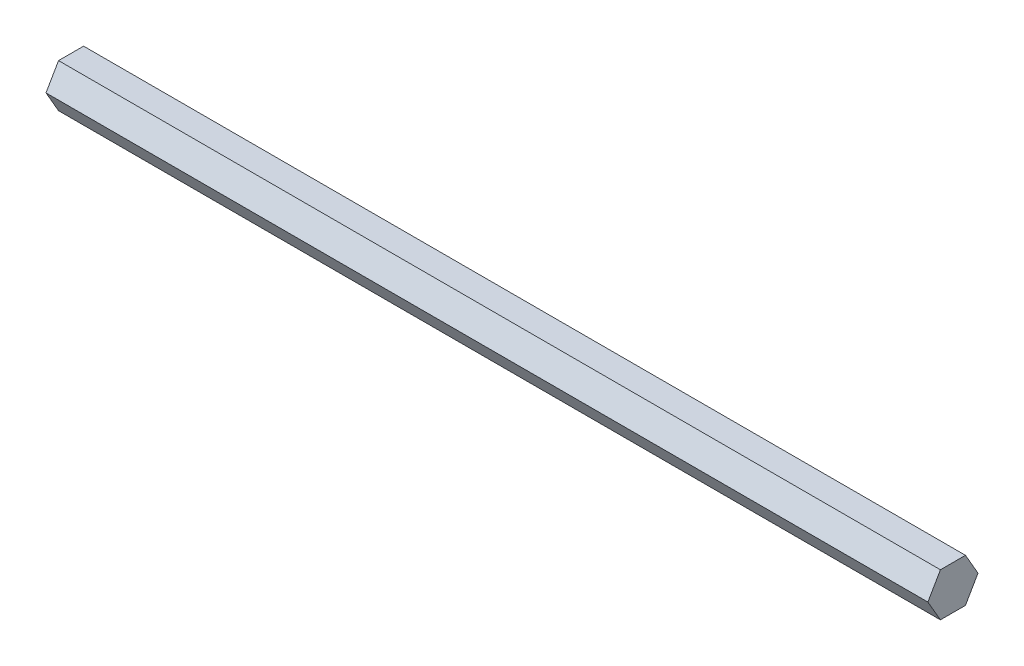
ISO-10303-21;
HEADER;
FILE_DESCRIPTION(('STEP AP214'),'2;1');
FILE_NAME('part.step','',(''),(''),'','','');
FILE_SCHEMA(('AUTOMOTIVE_DESIGN { 1 0 10303 214 1 1 1 1 }'));
ENDSEC;
DATA;
#1=APPLICATION_CONTEXT('core data for automotive mechanical design processes');
#2=APPLICATION_PROTOCOL_DEFINITION('international standard','automotive_design',2000,#1);
#3=PRODUCT_CONTEXT('',#1,'mechanical');
#4=PRODUCT('Part','Part','',(#3));
#5=PRODUCT_RELATED_PRODUCT_CATEGORY('part','',(#4));
#6=PRODUCT_DEFINITION_FORMATION('','',#4);
#7=PRODUCT_DEFINITION_CONTEXT('part definition',#1,'design');
#8=PRODUCT_DEFINITION('design','',#6,#7);
#9=PRODUCT_DEFINITION_SHAPE('','',#8);
#10=(LENGTH_UNIT() NAMED_UNIT(*) SI_UNIT(.MILLI.,.METRE.));
#11=(NAMED_UNIT(*) PLANE_ANGLE_UNIT() SI_UNIT($,.RADIAN.));
#12=(NAMED_UNIT(*) SI_UNIT($,.STERADIAN.) SOLID_ANGLE_UNIT());
#13=UNCERTAINTY_MEASURE_WITH_UNIT(LENGTH_MEASURE(1.E-05),#10,'distance_accuracy_value','');
#14=(GEOMETRIC_REPRESENTATION_CONTEXT(3) GLOBAL_UNCERTAINTY_ASSIGNED_CONTEXT((#13)) GLOBAL_UNIT_ASSIGNED_CONTEXT((#10,
#11,#12)) REPRESENTATION_CONTEXT('',''));
#15=CARTESIAN_POINT('',(0.,0.,0.));
#16=DIRECTION('',(0.,0.,1.));
#17=DIRECTION('',(1.,0.,0.));
#18=AXIS2_PLACEMENT_3D('',#15,#16,#17);
#19=CARTESIAN_POINT('',(101.6,0.,-2.88675134594813));
#20=DIRECTION('',(0.,-0.5,0.866025403784439));
#21=DIRECTION('',(0.,-0.866025403784439,-0.5));
#22=AXIS2_PLACEMENT_3D('',#19,#20,#21);
#23=PLANE('',#22);
#24=DIRECTION('',(0.,0.866025403784439,0.5));
#25=VECTOR('',#24,1.);
#26=CARTESIAN_POINT('',(0.,0.,-2.88675134594813));
#27=LINE('',#26,#25);
#28=CARTESIAN_POINT('',(0.,0.,-2.88675134594813));
#29=VERTEX_POINT('',#28);
#30=CARTESIAN_POINT('',(0.,2.5,-1.44337567297406));
#31=VERTEX_POINT('',#30);
#32=EDGE_CURVE('E125',#29,#31,#27,.T.);
#33=ORIENTED_EDGE('',*,*,#32,.T.);
#34=DIRECTION('',(-1.,0.,0.));
#35=VECTOR('',#34,1.);
#36=CARTESIAN_POINT('',(101.6,2.5,-1.44337567297406));
#37=LINE('',#36,#35);
#38=CARTESIAN_POINT('',(101.6,2.5,-1.44337567297406));
#39=VERTEX_POINT('',#38);
#40=EDGE_CURVE('E11',#39,#31,#37,.T.);
#41=ORIENTED_EDGE('',*,*,#40,.F.);
#42=DIRECTION('',(0.,0.866025403784439,0.5));
#43=VECTOR('',#42,1.);
#44=CARTESIAN_POINT('',(101.6,0.,-2.88675134594813));
#45=LINE('',#44,#43);
#46=CARTESIAN_POINT('',(101.6,0.,-2.88675134594813));
#47=VERTEX_POINT('',#46);
#48=EDGE_CURVE('E135',#47,#39,#45,.T.);
#49=ORIENTED_EDGE('',*,*,#48,.F.);
#50=DIRECTION('',(-1.,0.,0.));
#51=VECTOR('',#50,1.);
#52=CARTESIAN_POINT('',(101.6,0.,-2.88675134594813));
#53=LINE('',#52,#51);
#54=EDGE_CURVE('E121',#47,#29,#53,.T.);
#55=ORIENTED_EDGE('',*,*,#54,.T.);
#56=EDGE_LOOP('',(#33,#41,#49,#55));
#57=FACE_BOUND('',#56,.T.);
#58=ADVANCED_FACE('F41',(#57),#23,.F.);
#59=CARTESIAN_POINT('',(101.6,2.5,-1.44337567297406));
#60=DIRECTION('',(0.,-1.,0.));
#61=DIRECTION('',(0.,0.,-1.));
#62=AXIS2_PLACEMENT_3D('',#59,#60,#61);
#63=PLANE('',#62);
#64=DIRECTION('',(0.,0.,1.));
#65=VECTOR('',#64,1.);
#66=CARTESIAN_POINT('',(0.,2.5,-1.44337567297406));
#67=LINE('',#66,#65);
#68=CARTESIAN_POINT('',(0.,2.5,1.44337567297406));
#69=VERTEX_POINT('',#68);
#70=EDGE_CURVE('E128',#31,#69,#67,.T.);
#71=ORIENTED_EDGE('',*,*,#70,.T.);
#72=DIRECTION('',(-1.,0.,0.));
#73=VECTOR('',#72,1.);
#74=CARTESIAN_POINT('',(101.6,2.5,1.44337567297406));
#75=LINE('',#74,#73);
#76=CARTESIAN_POINT('',(101.6,2.5,1.44337567297406));
#77=VERTEX_POINT('',#76);
#78=EDGE_CURVE('E49',#77,#69,#75,.T.);
#79=ORIENTED_EDGE('',*,*,#78,.F.);
#80=DIRECTION('',(0.,0.,1.));
#81=VECTOR('',#80,1.);
#82=CARTESIAN_POINT('',(101.6,2.5,-1.44337567297406));
#83=LINE('',#82,#81);
#84=EDGE_CURVE('E94',#39,#77,#83,.T.);
#85=ORIENTED_EDGE('',*,*,#84,.F.);
#86=ORIENTED_EDGE('',*,*,#40,.T.);
#87=EDGE_LOOP('',(#71,#79,#85,#86));
#88=FACE_BOUND('',#87,.T.);
#89=ADVANCED_FACE('F159',(#88),#63,.F.);
#90=CARTESIAN_POINT('',(101.6,2.5,1.44337567297406));
#91=DIRECTION('',(0.,-0.5,-0.866025403784439));
#92=DIRECTION('',(0.,0.866025403784439,-0.5));
#93=AXIS2_PLACEMENT_3D('',#90,#91,#92);
#94=PLANE('',#93);
#95=DIRECTION('',(0.,-0.866025403784439,0.5));
#96=VECTOR('',#95,1.);
#97=CARTESIAN_POINT('',(0.,2.5,1.44337567297406));
#98=LINE('',#97,#96);
#99=CARTESIAN_POINT('',(0.,0.,2.88675134594813));
#100=VERTEX_POINT('',#99);
#101=EDGE_CURVE('E130',#69,#100,#98,.T.);
#102=ORIENTED_EDGE('',*,*,#101,.T.);
#103=DIRECTION('',(-1.,0.,0.));
#104=VECTOR('',#103,1.);
#105=CARTESIAN_POINT('',(101.6,0.,2.88675134594813));
#106=LINE('',#105,#104);
#107=CARTESIAN_POINT('',(101.6,0.,2.88675134594813));
#108=VERTEX_POINT('',#107);
#109=EDGE_CURVE('E116',#108,#100,#106,.T.);
#110=ORIENTED_EDGE('',*,*,#109,.F.);
#111=DIRECTION('',(0.,-0.866025403784439,0.5));
#112=VECTOR('',#111,1.);
#113=CARTESIAN_POINT('',(101.6,2.5,1.44337567297406));
#114=LINE('',#113,#112);
#115=EDGE_CURVE('E107',#77,#108,#114,.T.);
#116=ORIENTED_EDGE('',*,*,#115,.F.);
#117=ORIENTED_EDGE('',*,*,#78,.T.);
#118=EDGE_LOOP('',(#102,#110,#116,#117));
#119=FACE_BOUND('',#118,.T.);
#120=ADVANCED_FACE('F141',(#119),#94,.F.);
#121=CARTESIAN_POINT('',(101.6,0.,2.88675134594813));
#122=DIRECTION('',(0.,0.5,-0.866025403784438));
#123=DIRECTION('',(0.,0.866025403784439,0.5));
#124=AXIS2_PLACEMENT_3D('',#121,#122,#123);
#125=PLANE('',#124);
#126=DIRECTION('',(0.,-0.866025403784439,-0.5));
#127=VECTOR('',#126,1.);
#128=CARTESIAN_POINT('',(0.,0.,2.88675134594813));
#129=LINE('',#128,#127);
#130=CARTESIAN_POINT('',(0.,-2.5,1.44337567297406));
#131=VERTEX_POINT('',#130);
#132=EDGE_CURVE('E115',#100,#131,#129,.T.);
#133=ORIENTED_EDGE('',*,*,#132,.T.);
#134=DIRECTION('',(-1.,0.,0.));
#135=VECTOR('',#134,1.);
#136=CARTESIAN_POINT('',(101.6,-2.5,1.44337567297406));
#137=LINE('',#136,#135);
#138=CARTESIAN_POINT('',(101.6,-2.5,1.44337567297406));
#139=VERTEX_POINT('',#138);
#140=EDGE_CURVE('E112',#139,#131,#137,.T.);
#141=ORIENTED_EDGE('',*,*,#140,.F.);
#142=DIRECTION('',(0.,-0.866025403784439,-0.5));
#143=VECTOR('',#142,1.);
#144=CARTESIAN_POINT('',(101.6,0.,2.88675134594813));
#145=LINE('',#144,#143);
#146=EDGE_CURVE('E101',#108,#139,#145,.T.);
#147=ORIENTED_EDGE('',*,*,#146,.F.);
#148=ORIENTED_EDGE('',*,*,#109,.T.);
#149=EDGE_LOOP('',(#133,#141,#147,#148));
#150=FACE_BOUND('',#149,.T.);
#151=ADVANCED_FACE('F113',(#150),#125,.F.);
#152=CARTESIAN_POINT('',(101.6,-2.5,1.44337567297406));
#153=DIRECTION('',(0.,1.,0.));
#154=DIRECTION('',(0.,0.,1.));
#155=AXIS2_PLACEMENT_3D('',#152,#153,#154);
#156=PLANE('',#155);
#157=DIRECTION('',(0.,0.,-1.));
#158=VECTOR('',#157,1.);
#159=CARTESIAN_POINT('',(0.,-2.5,1.44337567297406));
#160=LINE('',#159,#158);
#161=CARTESIAN_POINT('',(0.,-2.5,-1.44337567297406));
#162=VERTEX_POINT('',#161);
#163=EDGE_CURVE('E80',#131,#162,#160,.T.);
#164=ORIENTED_EDGE('',*,*,#163,.T.);
#165=DIRECTION('',(-1.,0.,0.));
#166=VECTOR('',#165,1.);
#167=CARTESIAN_POINT('',(101.6,-2.5,-1.44337567297406));
#168=LINE('',#167,#166);
#169=CARTESIAN_POINT('',(101.6,-2.5,-1.44337567297406));
#170=VERTEX_POINT('',#169);
#171=EDGE_CURVE('E117',#170,#162,#168,.T.);
#172=ORIENTED_EDGE('',*,*,#171,.F.);
#173=DIRECTION('',(0.,0.,-1.));
#174=VECTOR('',#173,1.);
#175=CARTESIAN_POINT('',(101.6,-2.5,1.44337567297406));
#176=LINE('',#175,#174);
#177=EDGE_CURVE('E105',#139,#170,#176,.T.);
#178=ORIENTED_EDGE('',*,*,#177,.F.);
#179=ORIENTED_EDGE('',*,*,#140,.T.);
#180=EDGE_LOOP('',(#164,#172,#178,#179));
#181=FACE_BOUND('',#180,.T.);
#182=ADVANCED_FACE('F119',(#181),#156,.F.);
#183=CARTESIAN_POINT('',(101.6,-2.5,-1.44337567297406));
#184=DIRECTION('',(0.,0.5,0.866025403784439));
#185=DIRECTION('',(0.,-0.866025403784439,0.5));
#186=AXIS2_PLACEMENT_3D('',#183,#184,#185);
#187=PLANE('',#186);
#188=DIRECTION('',(0.,0.866025403784439,-0.5));
#189=VECTOR('',#188,1.);
#190=CARTESIAN_POINT('',(0.,-2.5,-1.44337567297406));
#191=LINE('',#190,#189);
#192=EDGE_CURVE('E86',#162,#29,#191,.T.);
#193=ORIENTED_EDGE('',*,*,#192,.T.);
#194=ORIENTED_EDGE('',*,*,#54,.F.);
#195=DIRECTION('',(0.,0.866025403784439,-0.5));
#196=VECTOR('',#195,1.);
#197=CARTESIAN_POINT('',(101.6,-2.5,-1.44337567297406));
#198=LINE('',#197,#196);
#199=EDGE_CURVE('E57',#170,#47,#198,.T.);
#200=ORIENTED_EDGE('',*,*,#199,.F.);
#201=ORIENTED_EDGE('',*,*,#171,.T.);
#202=EDGE_LOOP('',(#193,#194,#200,#201));
#203=FACE_BOUND('',#202,.T.);
#204=ADVANCED_FACE('F148',(#203),#187,.F.);
#205=CARTESIAN_POINT('',(101.6,0.,0.));
#206=DIRECTION('',(1.,0.,0.));
#207=DIRECTION('',(0.,0.,-1.));
#208=AXIS2_PLACEMENT_3D('',#205,#206,#207);
#209=PLANE('',#208);
#210=ORIENTED_EDGE('',*,*,#48,.T.);
#211=ORIENTED_EDGE('',*,*,#84,.T.);
#212=ORIENTED_EDGE('',*,*,#115,.T.);
#213=ORIENTED_EDGE('',*,*,#146,.T.);
#214=ORIENTED_EDGE('',*,*,#177,.T.);
#215=ORIENTED_EDGE('',*,*,#199,.T.);
#216=EDGE_LOOP('',(#210,#211,#212,#213,#214,#215));
#217=FACE_BOUND('',#216,.T.);
#218=ADVANCED_FACE('F103',(#217),#209,.T.);
#219=CARTESIAN_POINT('',(0.,0.,0.));
#220=DIRECTION('',(1.,0.,0.));
#221=DIRECTION('',(0.,0.,-1.));
#222=AXIS2_PLACEMENT_3D('',#219,#220,#221);
#223=PLANE('',#222);
#224=ORIENTED_EDGE('',*,*,#32,.F.);
#225=ORIENTED_EDGE('',*,*,#192,.F.);
#226=ORIENTED_EDGE('',*,*,#163,.F.);
#227=ORIENTED_EDGE('',*,*,#132,.F.);
#228=ORIENTED_EDGE('',*,*,#101,.F.);
#229=ORIENTED_EDGE('',*,*,#70,.F.);
#230=EDGE_LOOP('',(#224,#225,#226,#227,#228,#229));
#231=FACE_BOUND('',#230,.T.);
#232=ADVANCED_FACE('F144',(#231),#223,.F.);
#233=CLOSED_SHELL('',(#58,#89,#120,#151,#182,#204,#218,#232));
#234=MANIFOLD_SOLID_BREP('B2',#233);
#235=ADVANCED_BREP_SHAPE_REPRESENTATION('',(#18,#234),#14);
#236=SHAPE_DEFINITION_REPRESENTATION(#9,#235);
ENDSEC;
END-ISO-10303-21;
